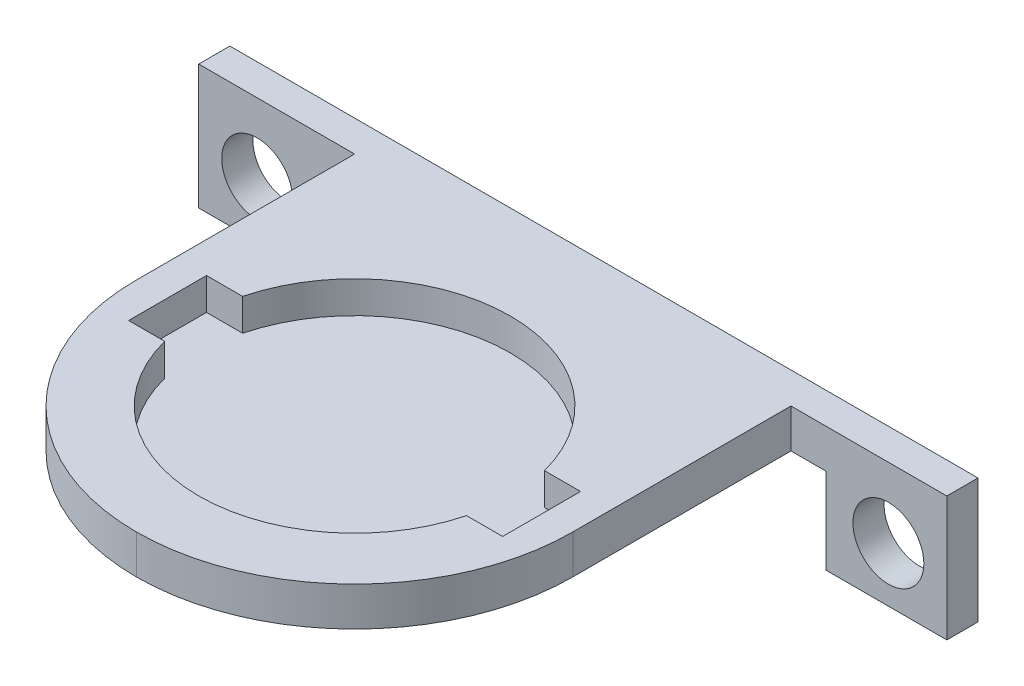
ISO-10303-21;
HEADER;
FILE_DESCRIPTION(('STEP AP214'),'2;1');
FILE_NAME('part.step','',(''),(''),'','','');
FILE_SCHEMA(('AUTOMOTIVE_DESIGN { 1 0 10303 214 1 1 1 1 }'));
ENDSEC;
DATA;
#1=APPLICATION_CONTEXT('core data for automotive mechanical design processes');
#2=APPLICATION_PROTOCOL_DEFINITION('international standard','automotive_design',2000,#1);
#3=PRODUCT_CONTEXT('',#1,'mechanical');
#4=PRODUCT('Part','Part','',(#3));
#5=PRODUCT_RELATED_PRODUCT_CATEGORY('part','',(#4));
#6=PRODUCT_DEFINITION_FORMATION('','',#4);
#7=PRODUCT_DEFINITION_CONTEXT('part definition',#1,'design');
#8=PRODUCT_DEFINITION('design','',#6,#7);
#9=PRODUCT_DEFINITION_SHAPE('','',#8);
#10=(LENGTH_UNIT() NAMED_UNIT(*) SI_UNIT(.MILLI.,.METRE.));
#11=(NAMED_UNIT(*) PLANE_ANGLE_UNIT() SI_UNIT($,.RADIAN.));
#12=(NAMED_UNIT(*) SI_UNIT($,.STERADIAN.) SOLID_ANGLE_UNIT());
#13=UNCERTAINTY_MEASURE_WITH_UNIT(LENGTH_MEASURE(1.E-05),#10,'distance_accuracy_value','');
#14=(GEOMETRIC_REPRESENTATION_CONTEXT(3) GLOBAL_UNCERTAINTY_ASSIGNED_CONTEXT((#13)) GLOBAL_UNIT_ASSIGNED_CONTEXT((#10,
#11,#12)) REPRESENTATION_CONTEXT('',''));
#15=CARTESIAN_POINT('',(0.,0.,0.));
#16=DIRECTION('',(0.,0.,1.));
#17=DIRECTION('',(1.,0.,0.));
#18=AXIS2_PLACEMENT_3D('',#15,#16,#17);
#19=CARTESIAN_POINT('',(-48.,-8.,4.));
#20=DIRECTION('',(0.,1.,0.));
#21=DIRECTION('',(0.,0.,1.));
#22=AXIS2_PLACEMENT_3D('',#19,#20,#21);
#23=PLANE('',#22);
#24=DIRECTION('',(1.,0.,0.));
#25=VECTOR('',#24,1.);
#26=CARTESIAN_POINT('',(-48.,-8.,0.));
#27=LINE('',#26,#25);
#28=CARTESIAN_POINT('',(-48.,-8.,0.));
#29=VERTEX_POINT('',#28);
#30=CARTESIAN_POINT('',(-32.5,-8.,0.));
#31=VERTEX_POINT('',#30);
#32=EDGE_CURVE('E350',#29,#31,#27,.T.);
#33=ORIENTED_EDGE('',*,*,#32,.T.);
#34=DIRECTION('',(0.,0.,1.));
#35=VECTOR('',#34,1.);
#36=CARTESIAN_POINT('',(-32.5,-8.,-46.));
#37=LINE('',#36,#35);
#38=CARTESIAN_POINT('',(-32.5,-8.,4.));
#39=VERTEX_POINT('',#38);
#40=EDGE_CURVE('E311',#31,#39,#37,.T.);
#41=ORIENTED_EDGE('',*,*,#40,.T.);
#42=DIRECTION('',(1.,0.,0.));
#43=VECTOR('',#42,1.);
#44=CARTESIAN_POINT('',(-48.,-8.,4.));
#45=LINE('',#44,#43);
#46=CARTESIAN_POINT('',(-48.,-8.,4.));
#47=VERTEX_POINT('',#46);
#48=EDGE_CURVE('E359',#47,#39,#45,.T.);
#49=ORIENTED_EDGE('',*,*,#48,.F.);
#50=DIRECTION('',(0.,0.,-1.));
#51=VECTOR('',#50,1.);
#52=CARTESIAN_POINT('',(-48.,-8.,4.));
#53=LINE('',#52,#51);
#54=EDGE_CURVE('E380',#47,#29,#53,.T.);
#55=ORIENTED_EDGE('',*,*,#54,.T.);
#56=EDGE_LOOP('',(#33,#41,#49,#55));
#57=FACE_BOUND('',#56,.T.);
#58=ADVANCED_FACE('F47',(#57),#23,.F.);
#59=CARTESIAN_POINT('',(0.,0.,4.));
#60=DIRECTION('',(0.,0.,1.));
#61=DIRECTION('',(1.,0.,0.));
#62=AXIS2_PLACEMENT_3D('',#59,#60,#61);
#63=PLANE('',#62);
#64=CARTESIAN_POINT('',(-40.5,-1.,4.));
#65=DIRECTION('',(0.,0.,1.));
#66=DIRECTION('',(1.,0.,0.));
#67=AXIS2_PLACEMENT_3D('',#64,#65,#66);
#68=CIRCLE('',#67,4.55000000000001);
#69=CARTESIAN_POINT('',(-35.95,-1.,4.));
#70=VERTEX_POINT('',#69);
#71=EDGE_CURVE('E292',#70,#70,#68,.T.);
#72=ORIENTED_EDGE('',*,*,#71,.F.);
#73=EDGE_LOOP('',(#72));
#74=FACE_BOUND('',#73,.T.);
#75=DIRECTION('',(0.,-1.,0.));
#76=VECTOR('',#75,1.);
#77=CARTESIAN_POINT('',(-32.5,-8.,4.));
#78=LINE('',#77,#76);
#79=CARTESIAN_POINT('',(-32.5,3.,4.));
#80=VERTEX_POINT('',#79);
#81=EDGE_CURVE('E287',#80,#39,#78,.T.);
#82=ORIENTED_EDGE('',*,*,#81,.F.);
#83=DIRECTION('',(-1.,0.,0.));
#84=VECTOR('',#83,1.);
#85=CARTESIAN_POINT('',(-32.5,3.,4.));
#86=LINE('',#85,#84);
#87=CARTESIAN_POINT('',(-28.,3.,4.));
#88=VERTEX_POINT('',#87);
#89=EDGE_CURVE('E306',#88,#80,#86,.T.);
#90=ORIENTED_EDGE('',*,*,#89,.F.);
#91=DIRECTION('',(0.,-1.,0.));
#92=VECTOR('',#91,1.);
#93=CARTESIAN_POINT('',(-28.,8.,4.));
#94=LINE('',#93,#92);
#95=CARTESIAN_POINT('',(-28.,8.,4.));
#96=VERTEX_POINT('',#95);
#97=EDGE_CURVE('E315',#96,#88,#94,.T.);
#98=ORIENTED_EDGE('',*,*,#97,.F.);
#99=DIRECTION('',(-1.,0.,0.));
#100=VECTOR('',#99,1.);
#101=CARTESIAN_POINT('',(-48.,8.,4.));
#102=LINE('',#101,#100);
#103=CARTESIAN_POINT('',(-48.,8.,4.));
#104=VERTEX_POINT('',#103);
#105=EDGE_CURVE('E349',#96,#104,#102,.T.);
#106=ORIENTED_EDGE('',*,*,#105,.T.);
#107=DIRECTION('',(0.,-1.,0.));
#108=VECTOR('',#107,1.);
#109=CARTESIAN_POINT('',(-48.,8.,4.));
#110=LINE('',#109,#108);
#111=EDGE_CURVE('E355',#104,#47,#110,.T.);
#112=ORIENTED_EDGE('',*,*,#111,.T.);
#113=ORIENTED_EDGE('',*,*,#48,.T.);
#114=EDGE_LOOP('',(#82,#90,#98,#106,#112,#113));
#115=FACE_BOUND('',#114,.T.);
#116=ADVANCED_FACE('F473',(#74,#115),#63,.T.);
#117=CARTESIAN_POINT('',(48.,8.,4.));
#118=DIRECTION('',(-1.,0.,0.));
#119=DIRECTION('',(0.,-1.,0.));
#120=AXIS2_PLACEMENT_3D('',#117,#118,#119);
#121=PLANE('',#120);
#122=DIRECTION('',(0.,1.,0.));
#123=VECTOR('',#122,1.);
#124=CARTESIAN_POINT('',(48.,8.,0.));
#125=LINE('',#124,#123);
#126=CARTESIAN_POINT('',(48.,-8.,0.));
#127=VERTEX_POINT('',#126);
#128=CARTESIAN_POINT('',(48.,8.,0.));
#129=VERTEX_POINT('',#128);
#130=EDGE_CURVE('E344',#127,#129,#125,.T.);
#131=ORIENTED_EDGE('',*,*,#130,.T.);
#132=DIRECTION('',(0.,0.,-1.));
#133=VECTOR('',#132,1.);
#134=CARTESIAN_POINT('',(48.,8.,4.));
#135=LINE('',#134,#133);
#136=CARTESIAN_POINT('',(48.,8.,4.));
#137=VERTEX_POINT('',#136);
#138=EDGE_CURVE('E388',#137,#129,#135,.T.);
#139=ORIENTED_EDGE('',*,*,#138,.F.);
#140=DIRECTION('',(0.,1.,0.));
#141=VECTOR('',#140,1.);
#142=CARTESIAN_POINT('',(48.,8.,4.));
#143=LINE('',#142,#141);
#144=CARTESIAN_POINT('',(48.,-8.,4.));
#145=VERTEX_POINT('',#144);
#146=EDGE_CURVE('E345',#145,#137,#143,.T.);
#147=ORIENTED_EDGE('',*,*,#146,.F.);
#148=DIRECTION('',(0.,0.,-1.));
#149=VECTOR('',#148,1.);
#150=CARTESIAN_POINT('',(48.,-8.,4.));
#151=LINE('',#150,#149);
#152=EDGE_CURVE('E363',#145,#127,#151,.T.);
#153=ORIENTED_EDGE('',*,*,#152,.T.);
#154=EDGE_LOOP('',(#131,#139,#147,#153));
#155=FACE_BOUND('',#154,.T.);
#156=ADVANCED_FACE('F449',(#155),#121,.F.);
#157=CARTESIAN_POINT('',(-48.,8.,4.));
#158=DIRECTION('',(0.,-1.,0.));
#159=DIRECTION('',(0.,0.,-1.));
#160=AXIS2_PLACEMENT_3D('',#157,#158,#159);
#161=PLANE('',#160);
#162=DIRECTION('',(1.,0.,0.));
#163=VECTOR('',#162,1.);
#164=CARTESIAN_POINT('',(0.,8.,37.));
#165=LINE('',#164,#163);
#166=CARTESIAN_POINT('',(19.3649167310371,8.,37.));
#167=VERTEX_POINT('',#166);
#168=CARTESIAN_POINT('',(24.,8.,37.));
#169=VERTEX_POINT('',#168);
#170=EDGE_CURVE('E244',#167,#169,#165,.T.);
#171=ORIENTED_EDGE('',*,*,#170,.F.);
#172=CARTESIAN_POINT('',(0.,8.,32.));
#173=DIRECTION('',(0.,1.,0.));
#174=DIRECTION('',(0.,0.,1.));
#175=AXIS2_PLACEMENT_3D('',#172,#173,#174);
#176=CIRCLE('',#175,20.);
#177=CARTESIAN_POINT('',(-19.3649167310371,8.,37.));
#178=VERTEX_POINT('',#177);
#179=EDGE_CURVE('E64',#178,#167,#176,.T.);
#180=ORIENTED_EDGE('',*,*,#179,.F.);
#181=DIRECTION('',(-1.,0.,0.));
#182=VECTOR('',#181,1.);
#183=CARTESIAN_POINT('',(0.,8.,37.));
#184=LINE('',#183,#182);
#185=CARTESIAN_POINT('',(-24.,8.,37.));
#186=VERTEX_POINT('',#185);
#187=EDGE_CURVE('E214',#178,#186,#184,.T.);
#188=ORIENTED_EDGE('',*,*,#187,.T.);
#189=DIRECTION('',(0.,0.,1.));
#190=VECTOR('',#189,1.);
#191=CARTESIAN_POINT('',(-24.,8.,0.));
#192=LINE('',#191,#190);
#193=CARTESIAN_POINT('',(-24.,8.,27.));
#194=VERTEX_POINT('',#193);
#195=EDGE_CURVE('E219',#194,#186,#192,.T.);
#196=ORIENTED_EDGE('',*,*,#195,.F.);
#197=DIRECTION('',(-1.,0.,0.));
#198=VECTOR('',#197,1.);
#199=CARTESIAN_POINT('',(0.,8.,27.));
#200=LINE('',#199,#198);
#201=CARTESIAN_POINT('',(-19.3649167310371,8.,27.));
#202=VERTEX_POINT('',#201);
#203=EDGE_CURVE('E256',#202,#194,#200,.T.);
#204=ORIENTED_EDGE('',*,*,#203,.F.);
#205=CARTESIAN_POINT('',(19.3649167310371,8.,27.));
#206=VERTEX_POINT('',#205);
#207=EDGE_CURVE('E245',#206,#202,#176,.T.);
#208=ORIENTED_EDGE('',*,*,#207,.F.);
#209=DIRECTION('',(1.,0.,0.));
#210=VECTOR('',#209,1.);
#211=CARTESIAN_POINT('',(0.,8.,27.));
#212=LINE('',#211,#210);
#213=CARTESIAN_POINT('',(24.,8.,27.));
#214=VERTEX_POINT('',#213);
#215=EDGE_CURVE('E252',#206,#214,#212,.T.);
#216=ORIENTED_EDGE('',*,*,#215,.T.);
#217=DIRECTION('',(0.,0.,1.));
#218=VECTOR('',#217,1.);
#219=CARTESIAN_POINT('',(24.,8.,0.));
#220=LINE('',#219,#218);
#221=EDGE_CURVE('E248',#214,#169,#220,.T.);
#222=ORIENTED_EDGE('',*,*,#221,.T.);
#223=EDGE_LOOP('',(#171,#180,#188,#196,#204,#208,#216,#222));
#224=FACE_BOUND('',#223,.T.);
#225=DIRECTION('',(0.,0.,-1.));
#226=VECTOR('',#225,1.);
#227=CARTESIAN_POINT('',(-28.,8.,60.));
#228=LINE('',#227,#226);
#229=CARTESIAN_POINT('',(-28.,8.,32.));
#230=VERTEX_POINT('',#229);
#231=EDGE_CURVE('E332',#230,#96,#228,.T.);
#232=ORIENTED_EDGE('',*,*,#231,.F.);
#233=CARTESIAN_POINT('',(0.,8.,32.));
#234=DIRECTION('',(0.,-1.,0.));
#235=DIRECTION('',(0.,0.,-1.));
#236=AXIS2_PLACEMENT_3D('',#233,#234,#235);
#237=CIRCLE('',#236,28.);
#238=CARTESIAN_POINT('',(0.,8.,60.));
#239=VERTEX_POINT('',#238);
#240=EDGE_CURVE('E57',#230,#239,#237,.F.);
#241=ORIENTED_EDGE('',*,*,#240,.T.);
#242=CARTESIAN_POINT('',(0.,8.,32.));
#243=DIRECTION('',(0.,-1.,0.));
#244=DIRECTION('',(0.,0.,-1.));
#245=AXIS2_PLACEMENT_3D('',#242,#243,#244);
#246=CIRCLE('',#245,28.);
#247=CARTESIAN_POINT('',(28.,8.,32.));
#248=VERTEX_POINT('',#247);
#249=EDGE_CURVE('E72',#239,#248,#246,.F.);
#250=ORIENTED_EDGE('',*,*,#249,.T.);
#251=DIRECTION('',(0.,0.,-1.));
#252=VECTOR('',#251,1.);
#253=CARTESIAN_POINT('',(28.,8.,60.));
#254=LINE('',#253,#252);
#255=CARTESIAN_POINT('',(28.,8.,4.));
#256=VERTEX_POINT('',#255);
#257=EDGE_CURVE('E335',#248,#256,#254,.T.);
#258=ORIENTED_EDGE('',*,*,#257,.T.);
#259=EDGE_CURVE('E351',#137,#256,#102,.T.);
#260=ORIENTED_EDGE('',*,*,#259,.F.);
#261=ORIENTED_EDGE('',*,*,#138,.T.);
#262=DIRECTION('',(-1.,0.,0.));
#263=VECTOR('',#262,1.);
#264=CARTESIAN_POINT('',(-48.,8.,0.));
#265=LINE('',#264,#263);
#266=CARTESIAN_POINT('',(-48.,8.,0.));
#267=VERTEX_POINT('',#266);
#268=EDGE_CURVE('E367',#129,#267,#265,.T.);
#269=ORIENTED_EDGE('',*,*,#268,.T.);
#270=DIRECTION('',(0.,0.,-1.));
#271=VECTOR('',#270,1.);
#272=CARTESIAN_POINT('',(-48.,8.,4.));
#273=LINE('',#272,#271);
#274=EDGE_CURVE('E384',#104,#267,#273,.T.);
#275=ORIENTED_EDGE('',*,*,#274,.F.);
#276=ORIENTED_EDGE('',*,*,#105,.F.);
#277=EDGE_LOOP('',(#232,#241,#250,#258,#260,#261,#269,#275,#276));
#278=FACE_BOUND('',#277,.T.);
#279=ADVANCED_FACE('F418',(#224,#278),#161,.F.);
#280=CARTESIAN_POINT('',(-48.,8.,4.));
#281=DIRECTION('',(1.,0.,0.));
#282=DIRECTION('',(0.,1.,0.));
#283=AXIS2_PLACEMENT_3D('',#280,#281,#282);
#284=PLANE('',#283);
#285=DIRECTION('',(0.,-1.,0.));
#286=VECTOR('',#285,1.);
#287=CARTESIAN_POINT('',(-48.,8.,0.));
#288=LINE('',#287,#286);
#289=EDGE_CURVE('E370',#267,#29,#288,.T.);
#290=ORIENTED_EDGE('',*,*,#289,.T.);
#291=ORIENTED_EDGE('',*,*,#54,.F.);
#292=ORIENTED_EDGE('',*,*,#111,.F.);
#293=ORIENTED_EDGE('',*,*,#274,.T.);
#294=EDGE_LOOP('',(#290,#291,#292,#293));
#295=FACE_BOUND('',#294,.T.);
#296=ADVANCED_FACE('F467',(#295),#284,.F.);
#297=CARTESIAN_POINT('',(32.5,-8.,4.));
#298=VERTEX_POINT('',#297);
#299=EDGE_CURVE('E358',#298,#145,#45,.T.);
#300=ORIENTED_EDGE('',*,*,#299,.F.);
#301=DIRECTION('',(0.,0.,1.));
#302=VECTOR('',#301,1.);
#303=CARTESIAN_POINT('',(32.5,-8.,-46.));
#304=LINE('',#303,#302);
#305=CARTESIAN_POINT('',(32.5,-8.,0.));
#306=VERTEX_POINT('',#305);
#307=EDGE_CURVE('E319',#306,#298,#304,.T.);
#308=ORIENTED_EDGE('',*,*,#307,.F.);
#309=EDGE_CURVE('E373',#306,#127,#27,.T.);
#310=ORIENTED_EDGE('',*,*,#309,.T.);
#311=ORIENTED_EDGE('',*,*,#152,.F.);
#312=EDGE_LOOP('',(#300,#308,#310,#311));
#313=FACE_BOUND('',#312,.T.);
#314=ADVANCED_FACE('F445',(#313),#23,.F.);
#315=CARTESIAN_POINT('',(40.5,-1.,4.));
#316=DIRECTION('',(0.,0.,1.));
#317=DIRECTION('',(1.,0.,0.));
#318=AXIS2_PLACEMENT_3D('',#315,#316,#317);
#319=CIRCLE('',#318,4.55);
#320=CARTESIAN_POINT('',(45.05,-1.,4.));
#321=VERTEX_POINT('',#320);
#322=EDGE_CURVE('E288',#321,#321,#319,.T.);
#323=ORIENTED_EDGE('',*,*,#322,.F.);
#324=EDGE_LOOP('',(#323));
#325=FACE_BOUND('',#324,.T.);
#326=CARTESIAN_POINT('',(32.5,3.,4.));
#327=VERTEX_POINT('',#326);
#328=CARTESIAN_POINT('',(28.,3.,4.));
#329=VERTEX_POINT('',#328);
#330=EDGE_CURVE('E307',#327,#329,#86,.T.);
#331=ORIENTED_EDGE('',*,*,#330,.F.);
#332=DIRECTION('',(0.,1.,0.));
#333=VECTOR('',#332,1.);
#334=CARTESIAN_POINT('',(32.5,-8.,4.));
#335=LINE('',#334,#333);
#336=EDGE_CURVE('E302',#298,#327,#335,.T.);
#337=ORIENTED_EDGE('',*,*,#336,.F.);
#338=ORIENTED_EDGE('',*,*,#299,.T.);
#339=ORIENTED_EDGE('',*,*,#146,.T.);
#340=ORIENTED_EDGE('',*,*,#259,.T.);
#341=DIRECTION('',(0.,1.,0.));
#342=VECTOR('',#341,1.);
#343=CARTESIAN_POINT('',(28.,8.,4.));
#344=LINE('',#343,#342);
#345=EDGE_CURVE('E328',#329,#256,#344,.T.);
#346=ORIENTED_EDGE('',*,*,#345,.F.);
#347=EDGE_LOOP('',(#331,#337,#338,#339,#340,#346));
#348=FACE_BOUND('',#347,.T.);
#349=ADVANCED_FACE('F440',(#325,#348),#63,.T.);
#350=CARTESIAN_POINT('',(0.,0.,0.));
#351=DIRECTION('',(0.,0.,1.));
#352=DIRECTION('',(1.,0.,0.));
#353=AXIS2_PLACEMENT_3D('',#350,#351,#352);
#354=PLANE('',#353);
#355=CARTESIAN_POINT('',(40.5,-1.,0.));
#356=DIRECTION('',(0.,0.,1.));
#357=DIRECTION('',(1.,0.,0.));
#358=AXIS2_PLACEMENT_3D('',#355,#356,#357);
#359=CIRCLE('',#358,4.55);
#360=CARTESIAN_POINT('',(45.05,-1.,0.));
#361=VERTEX_POINT('',#360);
#362=EDGE_CURVE('E283',#361,#361,#359,.T.);
#363=ORIENTED_EDGE('',*,*,#362,.T.);
#364=EDGE_LOOP('',(#363));
#365=FACE_BOUND('',#364,.T.);
#366=CARTESIAN_POINT('',(-40.5,-1.,0.));
#367=DIRECTION('',(0.,0.,1.));
#368=DIRECTION('',(1.,0.,0.));
#369=AXIS2_PLACEMENT_3D('',#366,#367,#368);
#370=CIRCLE('',#369,4.55000000000001);
#371=CARTESIAN_POINT('',(-35.95,-1.,0.));
#372=VERTEX_POINT('',#371);
#373=EDGE_CURVE('E296',#372,#372,#370,.T.);
#374=ORIENTED_EDGE('',*,*,#373,.T.);
#375=EDGE_LOOP('',(#374));
#376=FACE_BOUND('',#375,.T.);
#377=DIRECTION('',(-1.,0.,0.));
#378=VECTOR('',#377,1.);
#379=CARTESIAN_POINT('',(0.,3.,0.));
#380=LINE('',#379,#378);
#381=CARTESIAN_POINT('',(32.5,3.,0.));
#382=VERTEX_POINT('',#381);
#383=CARTESIAN_POINT('',(-32.5,3.,0.));
#384=VERTEX_POINT('',#383);
#385=EDGE_CURVE('E396',#382,#384,#380,.T.);
#386=ORIENTED_EDGE('',*,*,#385,.T.);
#387=DIRECTION('',(0.,-1.,0.));
#388=VECTOR('',#387,1.);
#389=CARTESIAN_POINT('',(-32.5,0.,0.));
#390=LINE('',#389,#388);
#391=EDGE_CURVE('E400',#384,#31,#390,.T.);
#392=ORIENTED_EDGE('',*,*,#391,.T.);
#393=ORIENTED_EDGE('',*,*,#32,.F.);
#394=ORIENTED_EDGE('',*,*,#289,.F.);
#395=ORIENTED_EDGE('',*,*,#268,.F.);
#396=ORIENTED_EDGE('',*,*,#130,.F.);
#397=ORIENTED_EDGE('',*,*,#309,.F.);
#398=DIRECTION('',(0.,1.,0.));
#399=VECTOR('',#398,1.);
#400=CARTESIAN_POINT('',(32.5,0.,0.));
#401=LINE('',#400,#399);
#402=EDGE_CURVE('E392',#306,#382,#401,.T.);
#403=ORIENTED_EDGE('',*,*,#402,.T.);
#404=EDGE_LOOP('',(#386,#392,#393,#394,#395,#396,#397,#403));
#405=FACE_BOUND('',#404,.T.);
#406=ADVANCED_FACE('F462',(#365,#376,#405),#354,.F.);
#407=CARTESIAN_POINT('',(-28.,8.,60.));
#408=DIRECTION('',(1.,0.,0.));
#409=DIRECTION('',(0.,0.,-1.));
#410=AXIS2_PLACEMENT_3D('',#407,#408,#409);
#411=PLANE('',#410);
#412=DIRECTION('',(0.,0.,-1.));
#413=VECTOR('',#412,1.);
#414=CARTESIAN_POINT('',(-28.,3.,60.));
#415=LINE('',#414,#413);
#416=CARTESIAN_POINT('',(-28.,3.,32.));
#417=VERTEX_POINT('',#416);
#418=EDGE_CURVE('E341',#417,#88,#415,.T.);
#419=ORIENTED_EDGE('',*,*,#418,.F.);
#420=DIRECTION('',(0.,-1.,0.));
#421=VECTOR('',#420,1.);
#422=CARTESIAN_POINT('',(-28.,8.,32.));
#423=LINE('',#422,#421);
#424=EDGE_CURVE('E410',#417,#230,#423,.F.);
#425=ORIENTED_EDGE('',*,*,#424,.T.);
#426=ORIENTED_EDGE('',*,*,#231,.T.);
#427=ORIENTED_EDGE('',*,*,#97,.T.);
#428=EDGE_LOOP('',(#419,#425,#426,#427));
#429=FACE_BOUND('',#428,.T.);
#430=ADVANCED_FACE('F478',(#429),#411,.F.);
#431=CARTESIAN_POINT('',(-28.,3.,60.));
#432=DIRECTION('',(0.,1.,0.));
#433=DIRECTION('',(0.,0.,1.));
#434=AXIS2_PLACEMENT_3D('',#431,#432,#433);
#435=PLANE('',#434);
#436=CARTESIAN_POINT('',(0.,3.,32.));
#437=DIRECTION('',(0.,1.,0.));
#438=DIRECTION('',(0.,0.,1.));
#439=AXIS2_PLACEMENT_3D('',#436,#437,#438);
#440=CIRCLE('',#439,28.);
#441=CARTESIAN_POINT('',(28.,3.,32.));
#442=VERTEX_POINT('',#441);
#443=CARTESIAN_POINT('',(0.,3.,60.));
#444=VERTEX_POINT('',#443);
#445=EDGE_CURVE('E404',#442,#444,#440,.F.);
#446=ORIENTED_EDGE('',*,*,#445,.T.);
#447=CARTESIAN_POINT('',(0.,3.,32.));
#448=DIRECTION('',(0.,1.,0.));
#449=DIRECTION('',(0.,0.,1.));
#450=AXIS2_PLACEMENT_3D('',#447,#448,#449);
#451=CIRCLE('',#450,28.);
#452=EDGE_CURVE('E407',#444,#417,#451,.F.);
#453=ORIENTED_EDGE('',*,*,#452,.T.);
#454=ORIENTED_EDGE('',*,*,#418,.T.);
#455=ORIENTED_EDGE('',*,*,#89,.T.);
#456=DIRECTION('',(0.,0.,1.));
#457=VECTOR('',#456,1.);
#458=CARTESIAN_POINT('',(-32.5,3.,-46.));
#459=LINE('',#458,#457);
#460=EDGE_CURVE('E312',#384,#80,#459,.T.);
#461=ORIENTED_EDGE('',*,*,#460,.F.);
#462=ORIENTED_EDGE('',*,*,#385,.F.);
#463=DIRECTION('',(0.,0.,1.));
#464=VECTOR('',#463,1.);
#465=CARTESIAN_POINT('',(32.5,3.,-46.));
#466=LINE('',#465,#464);
#467=EDGE_CURVE('E316',#382,#327,#466,.T.);
#468=ORIENTED_EDGE('',*,*,#467,.T.);
#469=ORIENTED_EDGE('',*,*,#330,.T.);
#470=DIRECTION('',(0.,0.,-1.));
#471=VECTOR('',#470,1.);
#472=CARTESIAN_POINT('',(28.,3.,60.));
#473=LINE('',#472,#471);
#474=EDGE_CURVE('E338',#442,#329,#473,.T.);
#475=ORIENTED_EDGE('',*,*,#474,.F.);
#476=EDGE_LOOP('',(#446,#453,#454,#455,#461,#462,#468,#469,#475));
#477=FACE_BOUND('',#476,.T.);
#478=ADVANCED_FACE('F456',(#477),#435,.F.);
#479=CARTESIAN_POINT('',(28.,8.,60.));
#480=DIRECTION('',(-1.,0.,0.));
#481=DIRECTION('',(0.,0.,1.));
#482=AXIS2_PLACEMENT_3D('',#479,#480,#481);
#483=PLANE('',#482);
#484=ORIENTED_EDGE('',*,*,#257,.F.);
#485=DIRECTION('',(0.,1.,0.));
#486=VECTOR('',#485,1.);
#487=CARTESIAN_POINT('',(28.,3.,32.));
#488=LINE('',#487,#486);
#489=EDGE_CURVE('E11',#248,#442,#488,.F.);
#490=ORIENTED_EDGE('',*,*,#489,.T.);
#491=ORIENTED_EDGE('',*,*,#474,.T.);
#492=ORIENTED_EDGE('',*,*,#345,.T.);
#493=EDGE_LOOP('',(#484,#490,#491,#492));
#494=FACE_BOUND('',#493,.T.);
#495=ADVANCED_FACE('F453',(#494),#483,.F.);
#496=CARTESIAN_POINT('',(-32.5,-8.,-46.));
#497=DIRECTION('',(-1.,0.,0.));
#498=DIRECTION('',(0.,0.,1.));
#499=AXIS2_PLACEMENT_3D('',#496,#497,#498);
#500=PLANE('',#499);
#501=ORIENTED_EDGE('',*,*,#460,.T.);
#502=ORIENTED_EDGE('',*,*,#81,.T.);
#503=ORIENTED_EDGE('',*,*,#40,.F.);
#504=ORIENTED_EDGE('',*,*,#391,.F.);
#505=EDGE_LOOP('',(#501,#502,#503,#504));
#506=FACE_BOUND('',#505,.T.);
#507=ADVANCED_FACE('F480',(#506),#500,.F.);
#508=CARTESIAN_POINT('',(32.5,-8.,-46.));
#509=DIRECTION('',(1.,0.,0.));
#510=DIRECTION('',(0.,0.,-1.));
#511=AXIS2_PLACEMENT_3D('',#508,#509,#510);
#512=PLANE('',#511);
#513=ORIENTED_EDGE('',*,*,#307,.T.);
#514=ORIENTED_EDGE('',*,*,#336,.T.);
#515=ORIENTED_EDGE('',*,*,#467,.F.);
#516=ORIENTED_EDGE('',*,*,#402,.F.);
#517=EDGE_LOOP('',(#513,#514,#515,#516));
#518=FACE_BOUND('',#517,.T.);
#519=ADVANCED_FACE('F460',(#518),#512,.F.);
#520=CARTESIAN_POINT('',(-40.5,-1.,0.));
#521=DIRECTION('',(0.,0.,1.));
#522=DIRECTION('',(1.,0.,0.));
#523=AXIS2_PLACEMENT_3D('',#520,#521,#522);
#524=CYLINDRICAL_SURFACE('',#523,4.55000000000001);
#525=ORIENTED_EDGE('',*,*,#373,.F.);
#526=EDGE_LOOP('',(#525));
#527=FACE_BOUND('',#526,.T.);
#528=ORIENTED_EDGE('',*,*,#71,.T.);
#529=EDGE_LOOP('',(#528));
#530=FACE_BOUND('',#529,.T.);
#531=ADVANCED_FACE('F487',(#527,#530),#524,.F.);
#532=CARTESIAN_POINT('',(40.5,-1.,0.));
#533=DIRECTION('',(0.,0.,1.));
#534=DIRECTION('',(1.,0.,0.));
#535=AXIS2_PLACEMENT_3D('',#532,#533,#534);
#536=CYLINDRICAL_SURFACE('',#535,4.55);
#537=ORIENTED_EDGE('',*,*,#362,.F.);
#538=EDGE_LOOP('',(#537));
#539=FACE_BOUND('',#538,.T.);
#540=ORIENTED_EDGE('',*,*,#322,.T.);
#541=EDGE_LOOP('',(#540));
#542=FACE_BOUND('',#541,.T.);
#543=ADVANCED_FACE('F520',(#539,#542),#536,.F.);
#544=CARTESIAN_POINT('',(0.,0.,32.));
#545=DIRECTION('',(0.,-1.,0.));
#546=DIRECTION('',(0.,0.,-1.));
#547=AXIS2_PLACEMENT_3D('',#544,#545,#546);
#548=CYLINDRICAL_SURFACE('',#547,28.);
#549=ORIENTED_EDGE('',*,*,#489,.F.);
#550=ORIENTED_EDGE('',*,*,#249,.F.);
#551=DIRECTION('',(0.,1.,0.));
#552=VECTOR('',#551,1.);
#553=CARTESIAN_POINT('',(0.,8.,60.));
#554=LINE('',#553,#552);
#555=EDGE_CURVE('E51',#444,#239,#554,.T.);
#556=ORIENTED_EDGE('',*,*,#555,.F.);
#557=ORIENTED_EDGE('',*,*,#445,.F.);
#558=EDGE_LOOP('',(#549,#550,#556,#557));
#559=FACE_BOUND('',#558,.T.);
#560=ADVANCED_FACE('F49',(#559),#548,.T.);
#561=CARTESIAN_POINT('',(0.,0.,32.));
#562=DIRECTION('',(0.,1.,0.));
#563=DIRECTION('',(0.,0.,1.));
#564=AXIS2_PLACEMENT_3D('',#561,#562,#563);
#565=CYLINDRICAL_SURFACE('',#564,28.);
#566=ORIENTED_EDGE('',*,*,#240,.F.);
#567=ORIENTED_EDGE('',*,*,#424,.F.);
#568=ORIENTED_EDGE('',*,*,#452,.F.);
#569=ORIENTED_EDGE('',*,*,#555,.T.);
#570=EDGE_LOOP('',(#566,#567,#568,#569));
#571=FACE_BOUND('',#570,.T.);
#572=ADVANCED_FACE('F428',(#571),#565,.T.);
#573=CARTESIAN_POINT('',(0.,3.9,32.));
#574=DIRECTION('',(0.,1.,0.));
#575=DIRECTION('',(0.,0.,1.));
#576=AXIS2_PLACEMENT_3D('',#573,#574,#575);
#577=CYLINDRICAL_SURFACE('',#576,20.);
#578=ORIENTED_EDGE('',*,*,#179,.T.);
#579=DIRECTION('',(0.,1.,0.));
#580=VECTOR('',#579,1.);
#581=CARTESIAN_POINT('',(19.3649167310371,3.9,37.));
#582=LINE('',#581,#580);
#583=CARTESIAN_POINT('',(19.3649167310371,3.9,37.));
#584=VERTEX_POINT('',#583);
#585=EDGE_CURVE('E189',#584,#167,#582,.T.);
#586=ORIENTED_EDGE('',*,*,#585,.F.);
#587=CARTESIAN_POINT('',(0.,3.9,32.));
#588=DIRECTION('',(0.,1.,0.));
#589=DIRECTION('',(0.,0.,1.));
#590=AXIS2_PLACEMENT_3D('',#587,#588,#589);
#591=CIRCLE('',#590,20.);
#592=CARTESIAN_POINT('',(-19.3649167310371,3.9,37.));
#593=VERTEX_POINT('',#592);
#594=EDGE_CURVE('E193',#593,#584,#591,.T.);
#595=ORIENTED_EDGE('',*,*,#594,.F.);
#596=DIRECTION('',(0.,1.,0.));
#597=VECTOR('',#596,1.);
#598=CARTESIAN_POINT('',(-19.3649167310371,3.9,37.));
#599=LINE('',#598,#597);
#600=EDGE_CURVE('E263',#593,#178,#599,.T.);
#601=ORIENTED_EDGE('',*,*,#600,.T.);
#602=EDGE_LOOP('',(#578,#586,#595,#601));
#603=FACE_BOUND('',#602,.T.);
#604=ADVANCED_FACE('F191',(#603),#577,.F.);
#605=CARTESIAN_POINT('',(0.,3.9,37.));
#606=DIRECTION('',(0.,0.,-1.));
#607=DIRECTION('',(-1.,0.,0.));
#608=AXIS2_PLACEMENT_3D('',#605,#606,#607);
#609=PLANE('',#608);
#610=ORIENTED_EDGE('',*,*,#187,.F.);
#611=ORIENTED_EDGE('',*,*,#600,.F.);
#612=DIRECTION('',(-1.,0.,0.));
#613=VECTOR('',#612,1.);
#614=CARTESIAN_POINT('',(0.,3.9,37.));
#615=LINE('',#614,#613);
#616=CARTESIAN_POINT('',(-24.,3.9,37.));
#617=VERTEX_POINT('',#616);
#618=EDGE_CURVE('E199',#593,#617,#615,.T.);
#619=ORIENTED_EDGE('',*,*,#618,.T.);
#620=DIRECTION('',(0.,1.,0.));
#621=VECTOR('',#620,1.);
#622=CARTESIAN_POINT('',(-24.,3.9,37.));
#623=LINE('',#622,#621);
#624=EDGE_CURVE('E266',#617,#186,#623,.T.);
#625=ORIENTED_EDGE('',*,*,#624,.T.);
#626=EDGE_LOOP('',(#610,#611,#619,#625));
#627=FACE_BOUND('',#626,.T.);
#628=ADVANCED_FACE('F517',(#627),#609,.T.);
#629=CARTESIAN_POINT('',(-24.,3.9,0.));
#630=DIRECTION('',(-1.,0.,0.));
#631=DIRECTION('',(0.,0.,1.));
#632=AXIS2_PLACEMENT_3D('',#629,#630,#631);
#633=PLANE('',#632);
#634=ORIENTED_EDGE('',*,*,#195,.T.);
#635=ORIENTED_EDGE('',*,*,#624,.F.);
#636=DIRECTION('',(0.,0.,1.));
#637=VECTOR('',#636,1.);
#638=CARTESIAN_POINT('',(-24.,3.9,0.));
#639=LINE('',#638,#637);
#640=CARTESIAN_POINT('',(-24.,3.9,27.));
#641=VERTEX_POINT('',#640);
#642=EDGE_CURVE('E230',#641,#617,#639,.T.);
#643=ORIENTED_EDGE('',*,*,#642,.F.);
#644=DIRECTION('',(0.,1.,0.));
#645=VECTOR('',#644,1.);
#646=CARTESIAN_POINT('',(-24.,3.9,27.));
#647=LINE('',#646,#645);
#648=EDGE_CURVE('E269',#641,#194,#647,.T.);
#649=ORIENTED_EDGE('',*,*,#648,.T.);
#650=EDGE_LOOP('',(#634,#635,#643,#649));
#651=FACE_BOUND('',#650,.T.);
#652=ADVANCED_FACE('F548',(#651),#633,.F.);
#653=CARTESIAN_POINT('',(0.,3.9,27.));
#654=DIRECTION('',(0.,0.,-1.));
#655=DIRECTION('',(-1.,0.,0.));
#656=AXIS2_PLACEMENT_3D('',#653,#654,#655);
#657=PLANE('',#656);
#658=ORIENTED_EDGE('',*,*,#203,.T.);
#659=ORIENTED_EDGE('',*,*,#648,.F.);
#660=DIRECTION('',(-1.,0.,0.));
#661=VECTOR('',#660,1.);
#662=CARTESIAN_POINT('',(0.,3.9,27.));
#663=LINE('',#662,#661);
#664=CARTESIAN_POINT('',(-19.3649167310371,3.9,27.));
#665=VERTEX_POINT('',#664);
#666=EDGE_CURVE('E223',#665,#641,#663,.T.);
#667=ORIENTED_EDGE('',*,*,#666,.F.);
#668=DIRECTION('',(0.,1.,0.));
#669=VECTOR('',#668,1.);
#670=CARTESIAN_POINT('',(-19.3649167310371,3.9,27.));
#671=LINE('',#670,#669);
#672=EDGE_CURVE('E272',#665,#202,#671,.T.);
#673=ORIENTED_EDGE('',*,*,#672,.T.);
#674=EDGE_LOOP('',(#658,#659,#667,#673));
#675=FACE_BOUND('',#674,.T.);
#676=ADVANCED_FACE('F544',(#675),#657,.F.);
#677=ORIENTED_EDGE('',*,*,#207,.T.);
#678=ORIENTED_EDGE('',*,*,#672,.F.);
#679=CARTESIAN_POINT('',(19.3649167310371,3.9,27.));
#680=VERTEX_POINT('',#679);
#681=EDGE_CURVE('E216',#680,#665,#591,.T.);
#682=ORIENTED_EDGE('',*,*,#681,.F.);
#683=DIRECTION('',(0.,1.,0.));
#684=VECTOR('',#683,1.);
#685=CARTESIAN_POINT('',(19.3649167310371,3.9,27.));
#686=LINE('',#685,#684);
#687=EDGE_CURVE('E275',#680,#206,#686,.T.);
#688=ORIENTED_EDGE('',*,*,#687,.T.);
#689=EDGE_LOOP('',(#677,#678,#682,#688));
#690=FACE_BOUND('',#689,.T.);
#691=ADVANCED_FACE('F519',(#690),#577,.F.);
#692=CARTESIAN_POINT('',(0.,3.9,27.));
#693=DIRECTION('',(0.,0.,1.));
#694=DIRECTION('',(1.,0.,0.));
#695=AXIS2_PLACEMENT_3D('',#692,#693,#694);
#696=PLANE('',#695);
#697=ORIENTED_EDGE('',*,*,#215,.F.);
#698=ORIENTED_EDGE('',*,*,#687,.F.);
#699=DIRECTION('',(1.,0.,0.));
#700=VECTOR('',#699,1.);
#701=CARTESIAN_POINT('',(0.,3.9,27.));
#702=LINE('',#701,#700);
#703=CARTESIAN_POINT('',(24.,3.9,27.));
#704=VERTEX_POINT('',#703);
#705=EDGE_CURVE('E224',#680,#704,#702,.T.);
#706=ORIENTED_EDGE('',*,*,#705,.T.);
#707=DIRECTION('',(0.,1.,0.));
#708=VECTOR('',#707,1.);
#709=CARTESIAN_POINT('',(24.,3.9,27.));
#710=LINE('',#709,#708);
#711=EDGE_CURVE('E278',#704,#214,#710,.T.);
#712=ORIENTED_EDGE('',*,*,#711,.T.);
#713=EDGE_LOOP('',(#697,#698,#706,#712));
#714=FACE_BOUND('',#713,.T.);
#715=ADVANCED_FACE('F539',(#714),#696,.T.);
#716=CARTESIAN_POINT('',(24.,3.9,0.));
#717=DIRECTION('',(-1.,0.,0.));
#718=DIRECTION('',(0.,0.,1.));
#719=AXIS2_PLACEMENT_3D('',#716,#717,#718);
#720=PLANE('',#719);
#721=ORIENTED_EDGE('',*,*,#221,.F.);
#722=ORIENTED_EDGE('',*,*,#711,.F.);
#723=DIRECTION('',(0.,0.,1.));
#724=VECTOR('',#723,1.);
#725=CARTESIAN_POINT('',(24.,3.9,0.));
#726=LINE('',#725,#724);
#727=CARTESIAN_POINT('',(24.,3.9,37.));
#728=VERTEX_POINT('',#727);
#729=EDGE_CURVE('E208',#704,#728,#726,.T.);
#730=ORIENTED_EDGE('',*,*,#729,.T.);
#731=DIRECTION('',(0.,1.,0.));
#732=VECTOR('',#731,1.);
#733=CARTESIAN_POINT('',(24.,3.9,37.));
#734=LINE('',#733,#732);
#735=EDGE_CURVE('E198',#728,#169,#734,.T.);
#736=ORIENTED_EDGE('',*,*,#735,.T.);
#737=EDGE_LOOP('',(#721,#722,#730,#736));
#738=FACE_BOUND('',#737,.T.);
#739=ADVANCED_FACE('F536',(#738),#720,.T.);
#740=CARTESIAN_POINT('',(0.,3.9,37.));
#741=DIRECTION('',(0.,0.,1.));
#742=DIRECTION('',(1.,0.,0.));
#743=AXIS2_PLACEMENT_3D('',#740,#741,#742);
#744=PLANE('',#743);
#745=ORIENTED_EDGE('',*,*,#170,.T.);
#746=ORIENTED_EDGE('',*,*,#735,.F.);
#747=DIRECTION('',(1.,0.,0.));
#748=VECTOR('',#747,1.);
#749=CARTESIAN_POINT('',(0.,3.9,37.));
#750=LINE('',#749,#748);
#751=EDGE_CURVE('E203',#584,#728,#750,.T.);
#752=ORIENTED_EDGE('',*,*,#751,.F.);
#753=ORIENTED_EDGE('',*,*,#585,.T.);
#754=EDGE_LOOP('',(#745,#746,#752,#753));
#755=FACE_BOUND('',#754,.T.);
#756=ADVANCED_FACE('F204',(#755),#744,.F.);
#757=CARTESIAN_POINT('',(0.,3.9,0.));
#758=DIRECTION('',(0.,1.,0.));
#759=DIRECTION('',(0.,0.,1.));
#760=AXIS2_PLACEMENT_3D('',#757,#758,#759);
#761=PLANE('',#760);
#762=ORIENTED_EDGE('',*,*,#594,.T.);
#763=ORIENTED_EDGE('',*,*,#751,.T.);
#764=ORIENTED_EDGE('',*,*,#729,.F.);
#765=ORIENTED_EDGE('',*,*,#705,.F.);
#766=ORIENTED_EDGE('',*,*,#681,.T.);
#767=ORIENTED_EDGE('',*,*,#666,.T.);
#768=ORIENTED_EDGE('',*,*,#642,.T.);
#769=ORIENTED_EDGE('',*,*,#618,.F.);
#770=EDGE_LOOP('',(#762,#763,#764,#765,#766,#767,#768,#769));
#771=FACE_BOUND('',#770,.T.);
#772=ADVANCED_FACE('F211',(#771),#761,.T.);
#773=CLOSED_SHELL('',(#58,#116,#156,#279,#296,#314,#349,#406,#430,#478,#495,#507,#519,#531,#543,
#560,#572,#604,#628,#652,#676,#691,#715,#739,#756,#772));
#774=MANIFOLD_SOLID_BREP('B2',#773);
#775=ADVANCED_BREP_SHAPE_REPRESENTATION('',(#18,#774),#14);
#776=SHAPE_DEFINITION_REPRESENTATION(#9,#775);
ENDSEC;
END-ISO-10303-21;
